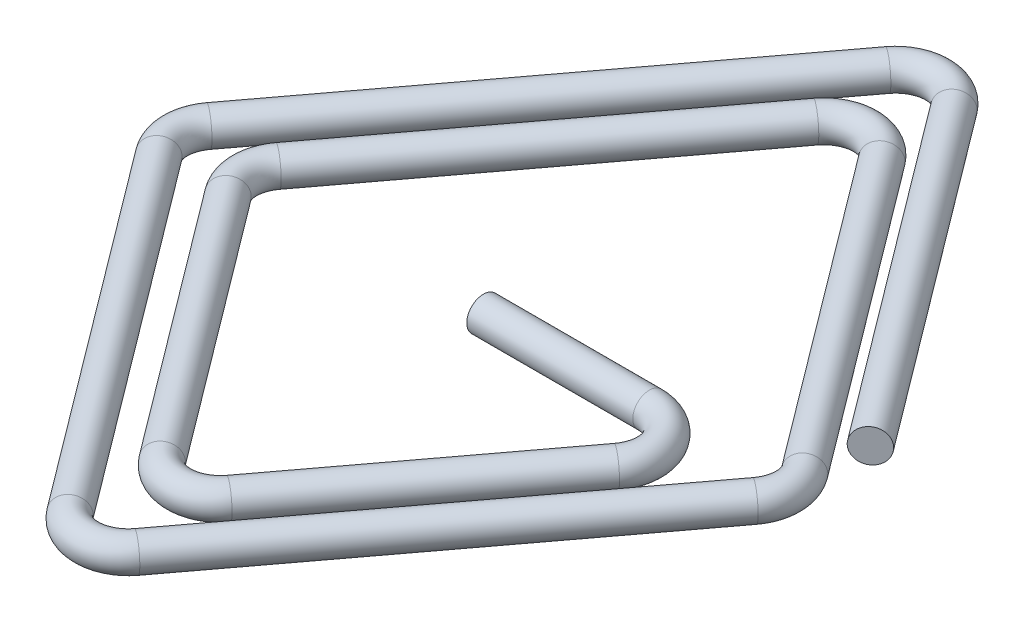
ISO-10303-21;
HEADER;
FILE_DESCRIPTION(('STEP AP214'),'2;1');
FILE_NAME('part.step','',(''),(''),'','','');
FILE_SCHEMA(('AUTOMOTIVE_DESIGN { 1 0 10303 214 1 1 1 1 }'));
ENDSEC;
DATA;
#1=APPLICATION_CONTEXT('core data for automotive mechanical design processes');
#2=APPLICATION_PROTOCOL_DEFINITION('international standard','automotive_design',2000,#1);
#3=PRODUCT_CONTEXT('',#1,'mechanical');
#4=PRODUCT('Part','Part','',(#3));
#5=PRODUCT_RELATED_PRODUCT_CATEGORY('part','',(#4));
#6=PRODUCT_DEFINITION_FORMATION('','',#4);
#7=PRODUCT_DEFINITION_CONTEXT('part definition',#1,'design');
#8=PRODUCT_DEFINITION('design','',#6,#7);
#9=PRODUCT_DEFINITION_SHAPE('','',#8);
#10=(LENGTH_UNIT() NAMED_UNIT(*) SI_UNIT(.MILLI.,.METRE.));
#11=(NAMED_UNIT(*) PLANE_ANGLE_UNIT() SI_UNIT($,.RADIAN.));
#12=(NAMED_UNIT(*) SI_UNIT($,.STERADIAN.) SOLID_ANGLE_UNIT());
#13=UNCERTAINTY_MEASURE_WITH_UNIT(LENGTH_MEASURE(1.E-05),#10,'distance_accuracy_value','');
#14=(GEOMETRIC_REPRESENTATION_CONTEXT(3) GLOBAL_UNCERTAINTY_ASSIGNED_CONTEXT((#13)) GLOBAL_UNIT_ASSIGNED_CONTEXT((#10,
#11,#12)) REPRESENTATION_CONTEXT('',''));
#15=CARTESIAN_POINT('',(0.,0.,0.));
#16=DIRECTION('',(0.,0.,1.));
#17=DIRECTION('',(1.,0.,0.));
#18=AXIS2_PLACEMENT_3D('',#15,#16,#17);
#19=CARTESIAN_POINT('',(5.99999999999997,0.,0.));
#20=DIRECTION('',(-1.,0.,0.));
#21=DIRECTION('',(0.,0.,1.));
#22=AXIS2_PLACEMENT_3D('',#19,#20,#21);
#23=CYLINDRICAL_SURFACE('',#22,0.6);
#24=CARTESIAN_POINT('',(5.99999999999997,0.,0.));
#25=DIRECTION('',(1.,0.,-1.42941214420489E-13));
#26=DIRECTION('',(-1.42830192118026E-13,0.,-1.));
#27=AXIS2_PLACEMENT_3D('',#24,#25,#26);
#28=CIRCLE('',#27,0.6);
#29=CARTESIAN_POINT('',(5.99999999999996,0.,-0.599999999999994));
#30=VERTEX_POINT('',#29);
#31=EDGE_CURVE('E39',#30,#30,#28,.T.);
#32=ORIENTED_EDGE('',*,*,#31,.F.);
#33=EDGE_LOOP('',(#32));
#34=FACE_BOUND('',#33,.T.);
#35=CARTESIAN_POINT('',(0.,0.,0.));
#36=DIRECTION('',(1.,0.,-1.42941214420489E-13));
#37=DIRECTION('',(-1.42830192118026E-13,0.,-1.));
#38=AXIS2_PLACEMENT_3D('',#35,#36,#37);
#39=CIRCLE('',#38,0.6);
#40=CARTESIAN_POINT('',(0.,0.,-0.599999999999995));
#41=VERTEX_POINT('',#40);
#42=EDGE_CURVE('E10',#41,#41,#39,.T.);
#43=ORIENTED_EDGE('',*,*,#42,.T.);
#44=EDGE_LOOP('',(#43));
#45=FACE_BOUND('',#44,.T.);
#46=ADVANCED_FACE('F33',(#34,#45),#23,.T.);
#47=CARTESIAN_POINT('',(6.,0.,1.5));
#48=DIRECTION('',(0.,1.,0.));
#49=DIRECTION('',(0.,0.,1.));
#50=AXIS2_PLACEMENT_3D('',#47,#48,#49);
#51=TOROIDAL_SURFACE('',#50,1.49999999999999,0.6);
#52=CARTESIAN_POINT('',(7.19999999999998,0.,2.40000000000002));
#53=DIRECTION('',(-0.599999999999914,0.,0.800000000000064));
#54=DIRECTION('',(0.800000000000064,0.,0.599999999999914));
#55=AXIS2_PLACEMENT_3D('',#52,#53,#54);
#56=CIRCLE('',#55,0.6);
#57=CARTESIAN_POINT('',(7.67999999999997,0.,2.76000000000003));
#58=VERTEX_POINT('',#57);
#59=EDGE_CURVE('E43',#58,#58,#56,.T.);
#60=CARTESIAN_POINT('',(6.,0.,1.5));
#61=DIRECTION('',(0.,1.,0.));
#62=DIRECTION('',(0.,0.,1.));
#63=AXIS2_PLACEMENT_3D('',#60,#61,#62);
#64=CIRCLE('',#63,2.09999999999999);
#65=EDGE_CURVE('',#58,#30,#64,.T.);
#66=ORIENTED_EDGE('',*,*,#59,.F.);
#67=ORIENTED_EDGE('',*,*,#31,.T.);
#68=ORIENTED_EDGE('',*,*,#65,.T.);
#69=ORIENTED_EDGE('',*,*,#65,.F.);
#70=EDGE_LOOP('',(#66,#68,#67,#69));
#71=FACE_BOUND('',#70,.T.);
#72=ADVANCED_FACE('F179',(#71),#51,.T.);
#73=CARTESIAN_POINT('',(1.2,0.,10.4));
#74=DIRECTION('',(0.6,0.,-0.8));
#75=DIRECTION('',(-0.8,0.,-0.6));
#76=AXIS2_PLACEMENT_3D('',#73,#74,#75);
#77=CYLINDRICAL_SURFACE('',#76,0.6);
#78=CARTESIAN_POINT('',(1.2,0.,10.4));
#79=DIRECTION('',(-0.599999999999914,0.,0.800000000000064));
#80=DIRECTION('',(0.800000000000064,0.,0.599999999999914));
#81=AXIS2_PLACEMENT_3D('',#78,#79,#80);
#82=CIRCLE('',#81,0.6);
#83=CARTESIAN_POINT('',(1.68000000000001,0.,10.76));
#84=VERTEX_POINT('',#83);
#85=EDGE_CURVE('E47',#84,#84,#82,.T.);
#86=ORIENTED_EDGE('',*,*,#85,.F.);
#87=EDGE_LOOP('',(#86));
#88=FACE_BOUND('',#87,.T.);
#89=ORIENTED_EDGE('',*,*,#59,.T.);
#90=EDGE_LOOP('',(#89));
#91=FACE_BOUND('',#90,.T.);
#92=ADVANCED_FACE('F173',(#88,#91),#77,.T.);
#93=CARTESIAN_POINT('',(0.,0.,9.5));
#94=DIRECTION('',(0.,1.,0.));
#95=DIRECTION('',(0.,0.,1.));
#96=AXIS2_PLACEMENT_3D('',#93,#94,#95);
#97=TOROIDAL_SURFACE('',#96,1.49999999999999,0.6);
#98=CARTESIAN_POINT('',(-1.2,0.,10.4));
#99=DIRECTION('',(-0.600000000000071,0.,-0.799999999999947));
#100=DIRECTION('',(-0.799999999999947,0.,0.600000000000071));
#101=AXIS2_PLACEMENT_3D('',#98,#99,#100);
#102=CIRCLE('',#101,0.6);
#103=CARTESIAN_POINT('',(-1.68000000000001,0.,10.76));
#104=VERTEX_POINT('',#103);
#105=EDGE_CURVE('E52',#104,#104,#102,.T.);
#106=CARTESIAN_POINT('',(0.,0.,9.5));
#107=DIRECTION('',(0.,1.,0.));
#108=DIRECTION('',(0.,0.,1.));
#109=AXIS2_PLACEMENT_3D('',#106,#107,#108);
#110=CIRCLE('',#109,2.09999999999999);
#111=EDGE_CURVE('',#104,#84,#110,.T.);
#112=ORIENTED_EDGE('',*,*,#105,.F.);
#113=ORIENTED_EDGE('',*,*,#85,.T.);
#114=ORIENTED_EDGE('',*,*,#111,.T.);
#115=ORIENTED_EDGE('',*,*,#111,.F.);
#116=EDGE_LOOP('',(#112,#114,#113,#115));
#117=FACE_BOUND('',#116,.T.);
#118=ADVANCED_FACE('F167',(#117),#97,.T.);
#119=CARTESIAN_POINT('',(-8.32499999999999,0.,0.900000000000003));
#120=DIRECTION('',(0.6,0.,0.8));
#121=DIRECTION('',(0.8,0.,-0.6));
#122=AXIS2_PLACEMENT_3D('',#119,#120,#121);
#123=CYLINDRICAL_SURFACE('',#122,0.6);
#124=CARTESIAN_POINT('',(-8.32499999999999,0.,0.900000000000003));
#125=DIRECTION('',(-0.600000000000071,0.,-0.799999999999947));
#126=DIRECTION('',(-0.799999999999947,0.,0.600000000000071));
#127=AXIS2_PLACEMENT_3D('',#124,#125,#126);
#128=CIRCLE('',#127,0.6);
#129=CARTESIAN_POINT('',(-8.80499999999999,0.,1.26000000000001));
#130=VERTEX_POINT('',#129);
#131=EDGE_CURVE('E55',#130,#130,#128,.T.);
#132=ORIENTED_EDGE('',*,*,#131,.F.);
#133=EDGE_LOOP('',(#132));
#134=FACE_BOUND('',#133,.T.);
#135=ORIENTED_EDGE('',*,*,#105,.T.);
#136=EDGE_LOOP('',(#135));
#137=FACE_BOUND('',#136,.T.);
#138=ADVANCED_FACE('F161',(#134,#137),#123,.T.);
#139=CARTESIAN_POINT('',(-7.125,0.,0.));
#140=DIRECTION('',(0.,1.,0.));
#141=DIRECTION('',(0.,0.,1.));
#142=AXIS2_PLACEMENT_3D('',#139,#140,#141);
#143=TOROIDAL_SURFACE('',#142,1.49999999999999,0.6);
#144=CARTESIAN_POINT('',(-8.32499999999999,0.,-0.900000000000001));
#145=DIRECTION('',(0.599999999999938,0.,-0.800000000000046));
#146=DIRECTION('',(-0.800000000000047,0.,-0.599999999999938));
#147=AXIS2_PLACEMENT_3D('',#144,#145,#146);
#148=CIRCLE('',#147,0.6);
#149=CARTESIAN_POINT('',(-8.80499999999999,0.,-1.26));
#150=VERTEX_POINT('',#149);
#151=EDGE_CURVE('E58',#150,#150,#148,.T.);
#152=CARTESIAN_POINT('',(-7.125,0.,0.));
#153=DIRECTION('',(0.,1.,0.));
#154=DIRECTION('',(0.,0.,1.));
#155=AXIS2_PLACEMENT_3D('',#152,#153,#154);
#156=CIRCLE('',#155,2.09999999999999);
#157=EDGE_CURVE('',#150,#130,#156,.T.);
#158=ORIENTED_EDGE('',*,*,#151,.F.);
#159=ORIENTED_EDGE('',*,*,#131,.T.);
#160=ORIENTED_EDGE('',*,*,#157,.T.);
#161=ORIENTED_EDGE('',*,*,#157,.F.);
#162=EDGE_LOOP('',(#158,#160,#159,#161));
#163=FACE_BOUND('',#162,.T.);
#164=ADVANCED_FACE('F155',(#163),#143,.T.);
#165=CARTESIAN_POINT('',(0.,0.,-12.));
#166=DIRECTION('',(-0.6,0.,0.8));
#167=DIRECTION('',(0.8,0.,0.6));
#168=AXIS2_PLACEMENT_3D('',#165,#166,#167);
#169=CYLINDRICAL_SURFACE('',#168,0.6);
#170=CARTESIAN_POINT('',(0.,0.,-12.));
#171=DIRECTION('',(0.599999999999938,0.,-0.800000000000046));
#172=DIRECTION('',(-0.800000000000047,0.,-0.599999999999938));
#173=AXIS2_PLACEMENT_3D('',#170,#171,#172);
#174=CIRCLE('',#173,0.6);
#175=CARTESIAN_POINT('',(-0.480000000000008,0.,-12.36));
#176=VERTEX_POINT('',#175);
#177=EDGE_CURVE('E61',#176,#176,#174,.T.);
#178=ORIENTED_EDGE('',*,*,#177,.F.);
#179=EDGE_LOOP('',(#178));
#180=FACE_BOUND('',#179,.T.);
#181=ORIENTED_EDGE('',*,*,#151,.T.);
#182=EDGE_LOOP('',(#181));
#183=FACE_BOUND('',#182,.T.);
#184=ADVANCED_FACE('F149',(#180,#183),#169,.T.);
#185=CARTESIAN_POINT('',(1.2,0.,-11.1));
#186=DIRECTION('',(0.,1.,0.));
#187=DIRECTION('',(0.,0.,1.));
#188=AXIS2_PLACEMENT_3D('',#185,#186,#187);
#189=TOROIDAL_SURFACE('',#188,1.49999999999999,0.6);
#190=CARTESIAN_POINT('',(2.4,0.,-12.));
#191=DIRECTION('',(0.600000000000047,0.,0.799999999999964));
#192=DIRECTION('',(0.799999999999965,0.,-0.600000000000048));
#193=AXIS2_PLACEMENT_3D('',#190,#191,#192);
#194=CIRCLE('',#193,0.6);
#195=CARTESIAN_POINT('',(2.88000000000001,0.,-12.36));
#196=VERTEX_POINT('',#195);
#197=EDGE_CURVE('E64',#196,#196,#194,.T.);
#198=CARTESIAN_POINT('',(1.2,0.,-11.1));
#199=DIRECTION('',(0.,1.,0.));
#200=DIRECTION('',(0.,0.,1.));
#201=AXIS2_PLACEMENT_3D('',#198,#199,#200);
#202=CIRCLE('',#201,2.09999999999999);
#203=EDGE_CURVE('',#196,#176,#202,.T.);
#204=ORIENTED_EDGE('',*,*,#197,.F.);
#205=ORIENTED_EDGE('',*,*,#177,.T.);
#206=ORIENTED_EDGE('',*,*,#203,.T.);
#207=ORIENTED_EDGE('',*,*,#203,.F.);
#208=EDGE_LOOP('',(#204,#206,#205,#207));
#209=FACE_BOUND('',#208,.T.);
#210=ADVANCED_FACE('F143',(#209),#189,.T.);
#211=CARTESIAN_POINT('',(10.775,0.,-0.833333333333337));
#212=DIRECTION('',(-0.6,0.,-0.8));
#213=DIRECTION('',(-0.8,0.,0.6));
#214=AXIS2_PLACEMENT_3D('',#211,#212,#213);
#215=CYLINDRICAL_SURFACE('',#214,0.6);
#216=CARTESIAN_POINT('',(10.775,0.,-0.833333333333337));
#217=DIRECTION('',(0.600000000000047,0.,0.799999999999964));
#218=DIRECTION('',(0.799999999999965,0.,-0.600000000000048));
#219=AXIS2_PLACEMENT_3D('',#216,#217,#218);
#220=CIRCLE('',#219,0.6);
#221=CARTESIAN_POINT('',(11.255,0.,-1.19333333333334));
#222=VERTEX_POINT('',#221);
#223=EDGE_CURVE('E67',#222,#222,#220,.T.);
#224=ORIENTED_EDGE('',*,*,#223,.F.);
#225=EDGE_LOOP('',(#224));
#226=FACE_BOUND('',#225,.T.);
#227=ORIENTED_EDGE('',*,*,#197,.T.);
#228=EDGE_LOOP('',(#227));
#229=FACE_BOUND('',#228,.T.);
#230=ADVANCED_FACE('F137',(#226,#229),#215,.T.);
#231=CARTESIAN_POINT('',(9.575,0.,0.0666666666666664));
#232=DIRECTION('',(0.,1.,0.));
#233=DIRECTION('',(0.,0.,1.));
#234=AXIS2_PLACEMENT_3D('',#231,#232,#233);
#235=TOROIDAL_SURFACE('',#234,1.49999999999999,0.6);
#236=CARTESIAN_POINT('',(10.775,0.,0.966666666666668));
#237=DIRECTION('',(-0.599999999999961,0.,0.800000000000029));
#238=DIRECTION('',(0.800000000000029,0.,0.599999999999961));
#239=AXIS2_PLACEMENT_3D('',#236,#237,#238);
#240=CIRCLE('',#239,0.6);
#241=CARTESIAN_POINT('',(11.255,0.,1.32666666666667));
#242=VERTEX_POINT('',#241);
#243=EDGE_CURVE('E70',#242,#242,#240,.T.);
#244=CARTESIAN_POINT('',(9.575,0.,0.0666666666666664));
#245=DIRECTION('',(0.,1.,0.));
#246=DIRECTION('',(0.,0.,1.));
#247=AXIS2_PLACEMENT_3D('',#244,#245,#246);
#248=CIRCLE('',#247,2.09999999999999);
#249=EDGE_CURVE('',#242,#222,#248,.T.);
#250=ORIENTED_EDGE('',*,*,#243,.F.);
#251=ORIENTED_EDGE('',*,*,#223,.T.);
#252=ORIENTED_EDGE('',*,*,#249,.T.);
#253=ORIENTED_EDGE('',*,*,#249,.F.);
#254=EDGE_LOOP('',(#250,#252,#251,#253));
#255=FACE_BOUND('',#254,.T.);
#256=ADVANCED_FACE('F131',(#255),#235,.T.);
#257=CARTESIAN_POINT('',(1.2,0.,13.7333333333333));
#258=DIRECTION('',(0.6,0.,-0.8));
#259=DIRECTION('',(-0.8,0.,-0.6));
#260=AXIS2_PLACEMENT_3D('',#257,#258,#259);
#261=CYLINDRICAL_SURFACE('',#260,0.6);
#262=CARTESIAN_POINT('',(1.2,0.,13.7333333333333));
#263=DIRECTION('',(-0.599999999999961,0.,0.800000000000029));
#264=DIRECTION('',(0.800000000000029,0.,0.599999999999961));
#265=AXIS2_PLACEMENT_3D('',#262,#263,#264);
#266=CIRCLE('',#265,0.6);
#267=CARTESIAN_POINT('',(1.68000000000001,0.,14.0933333333333));
#268=VERTEX_POINT('',#267);
#269=EDGE_CURVE('E73',#268,#268,#266,.T.);
#270=ORIENTED_EDGE('',*,*,#269,.F.);
#271=EDGE_LOOP('',(#270));
#272=FACE_BOUND('',#271,.T.);
#273=ORIENTED_EDGE('',*,*,#243,.T.);
#274=EDGE_LOOP('',(#273));
#275=FACE_BOUND('',#274,.T.);
#276=ADVANCED_FACE('F125',(#272,#275),#261,.T.);
#277=CARTESIAN_POINT('',(0.,0.,12.8333333333333));
#278=DIRECTION('',(0.,1.,0.));
#279=DIRECTION('',(0.,0.,1.));
#280=AXIS2_PLACEMENT_3D('',#277,#278,#279);
#281=TOROIDAL_SURFACE('',#280,1.5,0.6);
#282=CARTESIAN_POINT('',(-1.2,0.,13.7333333333333));
#283=DIRECTION('',(-0.600000000000024,0.,-0.799999999999982));
#284=DIRECTION('',(-0.799999999999982,0.,0.600000000000024));
#285=AXIS2_PLACEMENT_3D('',#282,#283,#284);
#286=CIRCLE('',#285,0.6);
#287=CARTESIAN_POINT('',(-1.68000000000001,0.,14.0933333333333));
#288=VERTEX_POINT('',#287);
#289=EDGE_CURVE('E76',#288,#288,#286,.T.);
#290=CARTESIAN_POINT('',(0.,0.,12.8333333333333));
#291=DIRECTION('',(0.,1.,0.));
#292=DIRECTION('',(0.,0.,1.));
#293=AXIS2_PLACEMENT_3D('',#290,#291,#292);
#294=CIRCLE('',#293,2.1);
#295=EDGE_CURVE('',#288,#268,#294,.T.);
#296=ORIENTED_EDGE('',*,*,#289,.F.);
#297=ORIENTED_EDGE('',*,*,#269,.T.);
#298=ORIENTED_EDGE('',*,*,#295,.T.);
#299=ORIENTED_EDGE('',*,*,#295,.F.);
#300=EDGE_LOOP('',(#296,#298,#297,#299));
#301=FACE_BOUND('',#300,.T.);
#302=ADVANCED_FACE('F119',(#301),#281,.T.);
#303=CARTESIAN_POINT('',(-10.825,0.,0.900000000000003));
#304=DIRECTION('',(0.6,0.,0.8));
#305=DIRECTION('',(0.8,0.,-0.6));
#306=AXIS2_PLACEMENT_3D('',#303,#304,#305);
#307=CYLINDRICAL_SURFACE('',#306,0.6);
#308=CARTESIAN_POINT('',(-10.825,0.,0.900000000000003));
#309=DIRECTION('',(-0.600000000000024,0.,-0.799999999999982));
#310=DIRECTION('',(-0.799999999999982,0.,0.600000000000024));
#311=AXIS2_PLACEMENT_3D('',#308,#309,#310);
#312=CIRCLE('',#311,0.6);
#313=CARTESIAN_POINT('',(-11.305,0.,1.26000000000001));
#314=VERTEX_POINT('',#313);
#315=EDGE_CURVE('E79',#314,#314,#312,.T.);
#316=ORIENTED_EDGE('',*,*,#315,.F.);
#317=EDGE_LOOP('',(#316));
#318=FACE_BOUND('',#317,.T.);
#319=ORIENTED_EDGE('',*,*,#289,.T.);
#320=EDGE_LOOP('',(#319));
#321=FACE_BOUND('',#320,.T.);
#322=ADVANCED_FACE('F113',(#318,#321),#307,.T.);
#323=CARTESIAN_POINT('',(-9.625,0.,0.));
#324=DIRECTION('',(0.,1.,0.));
#325=DIRECTION('',(0.,0.,1.));
#326=AXIS2_PLACEMENT_3D('',#323,#324,#325);
#327=TOROIDAL_SURFACE('',#326,1.5,0.6);
#328=CARTESIAN_POINT('',(-10.825,0.,-0.900000000000003));
#329=DIRECTION('',(0.599999999999985,0.,-0.800000000000011));
#330=DIRECTION('',(-0.800000000000012,0.,-0.599999999999985));
#331=AXIS2_PLACEMENT_3D('',#328,#329,#330);
#332=CIRCLE('',#331,0.6);
#333=CARTESIAN_POINT('',(-11.305,0.,-1.26000000000001));
#334=VERTEX_POINT('',#333);
#335=EDGE_CURVE('E82',#334,#334,#332,.T.);
#336=CARTESIAN_POINT('',(-9.625,0.,0.));
#337=DIRECTION('',(0.,1.,0.));
#338=DIRECTION('',(0.,0.,1.));
#339=AXIS2_PLACEMENT_3D('',#336,#337,#338);
#340=CIRCLE('',#339,2.1);
#341=EDGE_CURVE('',#334,#314,#340,.T.);
#342=ORIENTED_EDGE('',*,*,#335,.F.);
#343=ORIENTED_EDGE('',*,*,#315,.T.);
#344=ORIENTED_EDGE('',*,*,#341,.T.);
#345=ORIENTED_EDGE('',*,*,#341,.F.);
#346=EDGE_LOOP('',(#342,#344,#343,#345));
#347=FACE_BOUND('',#346,.T.);
#348=ADVANCED_FACE('F107',(#347),#327,.T.);
#349=CARTESIAN_POINT('',(-0.312500000000004,0.,-14.9166666666667));
#350=DIRECTION('',(-0.6,0.,0.8));
#351=DIRECTION('',(0.8,0.,0.6));
#352=AXIS2_PLACEMENT_3D('',#349,#350,#351);
#353=CYLINDRICAL_SURFACE('',#352,0.6);
#354=CARTESIAN_POINT('',(-0.312500000000004,0.,-14.9166666666667));
#355=DIRECTION('',(0.599999999999985,0.,-0.800000000000011));
#356=DIRECTION('',(-0.800000000000012,0.,-0.599999999999985));
#357=AXIS2_PLACEMENT_3D('',#354,#355,#356);
#358=CIRCLE('',#357,0.6);
#359=CARTESIAN_POINT('',(-0.792500000000008,0.,-15.2766666666667));
#360=VERTEX_POINT('',#359);
#361=EDGE_CURVE('E85',#360,#360,#358,.T.);
#362=ORIENTED_EDGE('',*,*,#361,.F.);
#363=EDGE_LOOP('',(#362));
#364=FACE_BOUND('',#363,.T.);
#365=ORIENTED_EDGE('',*,*,#335,.T.);
#366=EDGE_LOOP('',(#365));
#367=FACE_BOUND('',#366,.T.);
#368=ADVANCED_FACE('F101',(#364,#367),#353,.T.);
#369=CARTESIAN_POINT('',(0.8875,0.,-14.0166666666667));
#370=DIRECTION('',(0.,1.,0.));
#371=DIRECTION('',(0.,0.,1.));
#372=AXIS2_PLACEMENT_3D('',#369,#370,#371);
#373=TOROIDAL_SURFACE('',#372,1.5,0.6);
#374=CARTESIAN_POINT('',(2.08750000000001,0.,-14.9166666666667));
#375=DIRECTION('',(0.6,0.,0.8));
#376=DIRECTION('',(0.8,0.,-0.6));
#377=AXIS2_PLACEMENT_3D('',#374,#375,#376);
#378=CIRCLE('',#377,0.6);
#379=CARTESIAN_POINT('',(2.56750000000001,0.,-15.2766666666666));
#380=VERTEX_POINT('',#379);
#381=EDGE_CURVE('E88',#380,#380,#378,.T.);
#382=CARTESIAN_POINT('',(0.8875,0.,-14.0166666666667));
#383=DIRECTION('',(0.,1.,0.));
#384=DIRECTION('',(0.,0.,1.));
#385=AXIS2_PLACEMENT_3D('',#382,#383,#384);
#386=CIRCLE('',#385,2.1);
#387=EDGE_CURVE('',#380,#360,#386,.T.);
#388=ORIENTED_EDGE('',*,*,#381,.F.);
#389=ORIENTED_EDGE('',*,*,#361,.T.);
#390=ORIENTED_EDGE('',*,*,#387,.T.);
#391=ORIENTED_EDGE('',*,*,#387,.F.);
#392=EDGE_LOOP('',(#388,#390,#389,#391));
#393=FACE_BOUND('',#392,.T.);
#394=ADVANCED_FACE('F98',(#393),#373,.T.);
#395=CARTESIAN_POINT('',(2.08750000000001,0.,-14.9166666666667));
#396=DIRECTION('',(0.6,0.,0.8));
#397=DIRECTION('',(0.8,0.,-0.6));
#398=AXIS2_PLACEMENT_3D('',#395,#396,#397);
#399=CYLINDRICAL_SURFACE('',#398,0.6);
#400=CARTESIAN_POINT('',(11.1375,0.,-2.85));
#401=DIRECTION('',(0.6,0.,0.8));
#402=DIRECTION('',(0.8,0.,-0.6));
#403=AXIS2_PLACEMENT_3D('',#400,#401,#402);
#404=CIRCLE('',#403,0.6);
#405=CARTESIAN_POINT('',(11.6175,0.,-3.21));
#406=VERTEX_POINT('',#405);
#407=EDGE_CURVE('E89',#406,#406,#404,.T.);
#408=CARTESIAN_POINT('',(2.56750000000001,0.,-15.2766666666667));
#409=CARTESIAN_POINT('',(2.66177083333334,0.,-15.1509722222222));
#410=CARTESIAN_POINT('',(2.75604166666667,0.,-15.0252777777778));
#411=CARTESIAN_POINT('',(2.94458333333334,0.,-14.7738888888889));
#412=CARTESIAN_POINT('',(3.03885416666667,0.,-14.6481944444444));
#413=CARTESIAN_POINT('',(3.22739583333334,0.,-14.3968055555555));
#414=CARTESIAN_POINT('',(3.32166666666667,0.,-14.2711111111111));
#415=CARTESIAN_POINT('',(3.51020833333334,0.,-14.0197222222222));
#416=CARTESIAN_POINT('',(3.60447916666667,0.,-13.8940277777778));
#417=CARTESIAN_POINT('',(3.79302083333334,0.,-13.6426388888889));
#418=CARTESIAN_POINT('',(3.88729166666667,0.,-13.5169444444444));
#419=CARTESIAN_POINT('',(4.07583333333334,0.,-13.2655555555555));
#420=CARTESIAN_POINT('',(4.17010416666667,0.,-13.1398611111111));
#421=CARTESIAN_POINT('',(4.35864583333334,0.,-12.8884722222222));
#422=CARTESIAN_POINT('',(4.45291666666667,0.,-12.7627777777778));
#423=CARTESIAN_POINT('',(4.64145833333334,0.,-12.5113888888889));
#424=CARTESIAN_POINT('',(4.73572916666667,0.,-12.3856944444444));
#425=CARTESIAN_POINT('',(4.92427083333334,0.,-12.1343055555555));
#426=CARTESIAN_POINT('',(5.01854166666667,0.,-12.0086111111111));
#427=CARTESIAN_POINT('',(5.20708333333334,0.,-11.7572222222222));
#428=CARTESIAN_POINT('',(5.30135416666667,0.,-11.6315277777778));
#429=CARTESIAN_POINT('',(5.48989583333334,0.,-11.3801388888889));
#430=CARTESIAN_POINT('',(5.58416666666667,0.,-11.2544444444444));
#431=CARTESIAN_POINT('',(5.77270833333334,0.,-11.0030555555555));
#432=CARTESIAN_POINT('',(5.86697916666667,0.,-10.8773611111111));
#433=CARTESIAN_POINT('',(6.05552083333334,0.,-10.6259722222222));
#434=CARTESIAN_POINT('',(6.14979166666667,0.,-10.5002777777778));
#435=CARTESIAN_POINT('',(6.33833333333334,0.,-10.2488888888889));
#436=CARTESIAN_POINT('',(6.43260416666667,0.,-10.1231944444444));
#437=CARTESIAN_POINT('',(6.62114583333334,0.,-9.87180555555555));
#438=CARTESIAN_POINT('',(6.71541666666667,0.,-9.7461111111111));
#439=CARTESIAN_POINT('',(6.90395833333334,0.,-9.49472222222222));
#440=CARTESIAN_POINT('',(6.99822916666667,0.,-9.36902777777777));
#441=CARTESIAN_POINT('',(7.18677083333334,0.,-9.11763888888888));
#442=CARTESIAN_POINT('',(7.28104166666667,0.,-8.99194444444444));
#443=CARTESIAN_POINT('',(7.46958333333334,0.,-8.74055555555555));
#444=CARTESIAN_POINT('',(7.56385416666667,0.,-8.6148611111111));
#445=CARTESIAN_POINT('',(7.75239583333334,0.,-8.36347222222222));
#446=CARTESIAN_POINT('',(7.84666666666667,0.,-8.23777777777777));
#447=CARTESIAN_POINT('',(8.03520833333334,0.,-7.98638888888888));
#448=CARTESIAN_POINT('',(8.12947916666667,0.,-7.86069444444444));
#449=CARTESIAN_POINT('',(8.31802083333334,0.,-7.60930555555555));
#450=CARTESIAN_POINT('',(8.41229166666667,0.,-7.4836111111111));
#451=CARTESIAN_POINT('',(8.60083333333334,0.,-7.23222222222222));
#452=CARTESIAN_POINT('',(8.69510416666667,0.,-7.10652777777777));
#453=CARTESIAN_POINT('',(8.88364583333334,0.,-6.85513888888888));
#454=CARTESIAN_POINT('',(8.97791666666667,0.,-6.72944444444444));
#455=CARTESIAN_POINT('',(9.16645833333333,0.,-6.47805555555555));
#456=CARTESIAN_POINT('',(9.26072916666667,0.,-6.35236111111111));
#457=CARTESIAN_POINT('',(9.44927083333334,0.,-6.10097222222222));
#458=CARTESIAN_POINT('',(9.54354166666667,0.,-5.97527777777777));
#459=CARTESIAN_POINT('',(9.73208333333333,0.,-5.72388888888888));
#460=CARTESIAN_POINT('',(9.82635416666667,0.,-5.59819444444444));
#461=CARTESIAN_POINT('',(10.0148958333333,0.,-5.34680555555555));
#462=CARTESIAN_POINT('',(10.1091666666667,0.,-5.2211111111111));
#463=CARTESIAN_POINT('',(10.2977083333333,0.,-4.96972222222222));
#464=CARTESIAN_POINT('',(10.3919791666667,0.,-4.84402777777777));
#465=CARTESIAN_POINT('',(10.5805208333333,0.,-4.59263888888888));
#466=CARTESIAN_POINT('',(10.6747916666667,0.,-4.46694444444444));
#467=CARTESIAN_POINT('',(10.8633333333333,0.,-4.21555555555555));
#468=CARTESIAN_POINT('',(10.9576041666667,0.,-4.08986111111111));
#469=CARTESIAN_POINT('',(11.1461458333333,0.,-3.83847222222222));
#470=CARTESIAN_POINT('',(11.2404166666667,0.,-3.71277777777777));
#471=CARTESIAN_POINT('',(11.4289583333333,0.,-3.46138888888889));
#472=CARTESIAN_POINT('',(11.5232291666667,0.,-3.33569444444444));
#473=CARTESIAN_POINT('',(11.6175,0.,-3.21));
#474=B_SPLINE_CURVE_WITH_KNOTS('',3,(#408,#409,#410,#411,#412,#413,#414,#415,#416,#417,#418,
#419,#420,#421,#422,#423,#424,#425,#426,#427,#428,#429,#430,#431,#432,#433,#434,#435,#436,#437,
#438,#439,#440,#441,#442,#443,#444,#445,#446,#447,#448,#449,#450,#451,#452,#453,#454,#455,#456,
#457,#458,#459,#460,#461,#462,#463,#464,#465,#466,#467,#468,#469,#470,#471,#472,#473),
.UNSPECIFIED.,.F.,.F.,(4,2,2,2,2,2,2,2,2,2,2,2,2,2,2,2,2,2,2,2,2,2,2,2,2,2,2,2,2,2,2,2,4),(0.,
0.471354166666667,0.942708333333333,1.4140625,1.88541666666667,2.35677083333333,2.828125,
3.29947916666666,3.77083333333333,4.2421875,4.71354166666666,5.18489583333333,5.65624999999999,
6.12760416666666,6.59895833333333,7.07031249999999,7.54166666666666,8.01302083333333,
8.48437499999999,8.95572916666666,9.42708333333333,9.89843749999999,10.3697916666667,
10.8411458333333,11.3125,11.7838541666667,12.2552083333333,12.7265625,13.1979166666667,
13.6692708333333,14.140625,14.6119791666667,15.0833333333333),.UNSPECIFIED.);
#475=EDGE_CURVE('BSEAM95',#380,#406,#474,.T.);
#476=ORIENTED_EDGE('',*,*,#381,.T.);
#477=ORIENTED_EDGE('',*,*,#407,.F.);
#478=ORIENTED_EDGE('',*,*,#475,.T.);
#479=ORIENTED_EDGE('',*,*,#475,.F.);
#480=EDGE_LOOP('',(#476,#478,#477,#479));
#481=FACE_BOUND('',#480,.T.);
#482=ADVANCED_FACE('F95',(#481),#399,.T.);
#483=CARTESIAN_POINT('',(0.,0.,0.));
#484=DIRECTION('',(1.,0.,-1.42941214420489E-13));
#485=DIRECTION('',(-1.42830192118026E-13,0.,-1.));
#486=AXIS2_PLACEMENT_3D('',#483,#484,#485);
#487=PLANE('',#486);
#488=ORIENTED_EDGE('',*,*,#42,.F.);
#489=EDGE_LOOP('',(#488));
#490=FACE_BOUND('',#489,.T.);
#491=ADVANCED_FACE('F191',(#490),#487,.F.);
#492=CARTESIAN_POINT('',(11.1375,0.,-2.85));
#493=DIRECTION('',(0.6,0.,0.8));
#494=DIRECTION('',(0.8,0.,-0.6));
#495=AXIS2_PLACEMENT_3D('',#492,#493,#494);
#496=PLANE('',#495);
#497=ORIENTED_EDGE('',*,*,#407,.T.);
#498=EDGE_LOOP('',(#497));
#499=FACE_BOUND('',#498,.T.);
#500=ADVANCED_FACE('F192',(#499),#496,.T.);
#501=CLOSED_SHELL('',(#46,#72,#92,#118,#138,#164,#184,#210,#230,#256,#276,#302,#322,#348,#368,
#394,#482,#491,#500));
#502=MANIFOLD_SOLID_BREP('B2',#501);
#503=ADVANCED_BREP_SHAPE_REPRESENTATION('',(#18,#502),#14);
#504=SHAPE_DEFINITION_REPRESENTATION(#9,#503);
ENDSEC;
END-ISO-10303-21;
